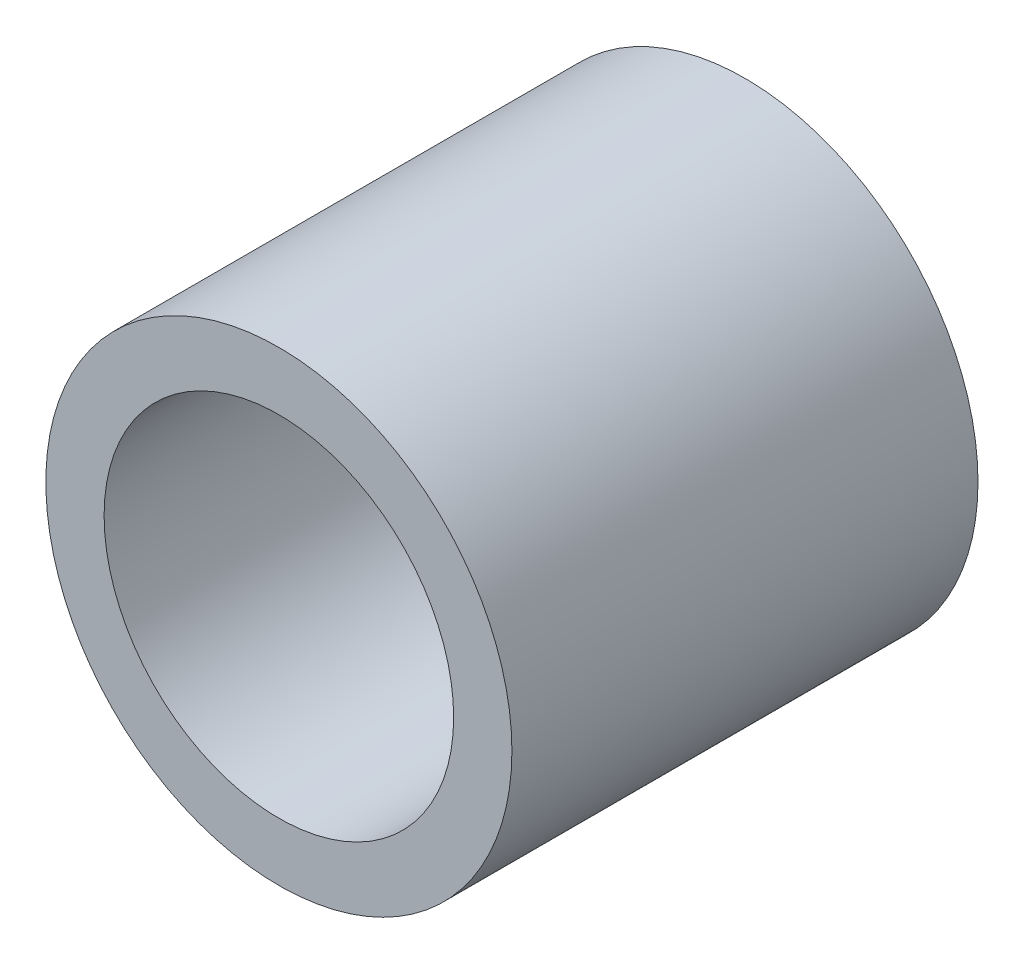
ISO-10303-21;
HEADER;
FILE_DESCRIPTION(('STEP AP214'),'2;1');
FILE_NAME('part.step','',(''),(''),'','','');
FILE_SCHEMA(('AUTOMOTIVE_DESIGN { 1 0 10303 214 1 1 1 1 }'));
ENDSEC;
DATA;
#1=APPLICATION_CONTEXT('core data for automotive mechanical design processes');
#2=APPLICATION_PROTOCOL_DEFINITION('international standard','automotive_design',2000,#1);
#3=PRODUCT_CONTEXT('',#1,'mechanical');
#4=PRODUCT('Part','Part','',(#3));
#5=PRODUCT_RELATED_PRODUCT_CATEGORY('part','',(#4));
#6=PRODUCT_DEFINITION_FORMATION('','',#4);
#7=PRODUCT_DEFINITION_CONTEXT('part definition',#1,'design');
#8=PRODUCT_DEFINITION('design','',#6,#7);
#9=PRODUCT_DEFINITION_SHAPE('','',#8);
#10=(LENGTH_UNIT() NAMED_UNIT(*) SI_UNIT(.MILLI.,.METRE.));
#11=(NAMED_UNIT(*) PLANE_ANGLE_UNIT() SI_UNIT($,.RADIAN.));
#12=(NAMED_UNIT(*) SI_UNIT($,.STERADIAN.) SOLID_ANGLE_UNIT());
#13=UNCERTAINTY_MEASURE_WITH_UNIT(LENGTH_MEASURE(1.E-05),#10,'distance_accuracy_value','');
#14=(GEOMETRIC_REPRESENTATION_CONTEXT(3) GLOBAL_UNCERTAINTY_ASSIGNED_CONTEXT((#13)) GLOBAL_UNIT_ASSIGNED_CONTEXT((#10,
#11,#12)) REPRESENTATION_CONTEXT('',''));
#15=CARTESIAN_POINT('',(0.,0.,0.));
#16=DIRECTION('',(0.,0.,1.));
#17=DIRECTION('',(1.,0.,0.));
#18=AXIS2_PLACEMENT_3D('',#15,#16,#17);
#19=CARTESIAN_POINT('',(0.,0.,12.7));
#20=DIRECTION('',(0.,0.,1.));
#21=DIRECTION('',(1.,0.,0.));
#22=AXIS2_PLACEMENT_3D('',#19,#20,#21);
#23=PLANE('',#22);
#24=CARTESIAN_POINT('',(0.,0.,12.7));
#25=DIRECTION('',(0.,0.,1.));
#26=DIRECTION('',(1.,0.,0.));
#27=AXIS2_PLACEMENT_3D('',#24,#25,#26);
#28=CIRCLE('',#27,12.7);
#29=CARTESIAN_POINT('',(12.7,0.,12.7));
#30=VERTEX_POINT('',#29);
#31=EDGE_CURVE('E10',#30,#30,#28,.T.);
#32=ORIENTED_EDGE('',*,*,#31,.T.);
#33=EDGE_LOOP('',(#32));
#34=FACE_BOUND('',#33,.T.);
#35=CARTESIAN_POINT('',(0.,0.,12.7));
#36=DIRECTION('',(0.,0.,1.));
#37=DIRECTION('',(1.,0.,0.));
#38=AXIS2_PLACEMENT_3D('',#35,#36,#37);
#39=CIRCLE('',#38,9.525);
#40=CARTESIAN_POINT('',(9.525,0.,12.7));
#41=VERTEX_POINT('',#40);
#42=EDGE_CURVE('E50',#41,#41,#39,.T.);
#43=ORIENTED_EDGE('',*,*,#42,.F.);
#44=EDGE_LOOP('',(#43));
#45=FACE_BOUND('',#44,.T.);
#46=ADVANCED_FACE('F39',(#34,#45),#23,.T.);
#47=CARTESIAN_POINT('',(0.,0.,-12.7));
#48=DIRECTION('',(0.,0.,1.));
#49=DIRECTION('',(1.,0.,0.));
#50=AXIS2_PLACEMENT_3D('',#47,#48,#49);
#51=PLANE('',#50);
#52=CARTESIAN_POINT('',(0.,0.,-12.7));
#53=DIRECTION('',(0.,0.,1.));
#54=DIRECTION('',(1.,0.,0.));
#55=AXIS2_PLACEMENT_3D('',#52,#53,#54);
#56=CIRCLE('',#55,12.7);
#57=CARTESIAN_POINT('',(12.7,0.,-12.7));
#58=VERTEX_POINT('',#57);
#59=EDGE_CURVE('E43',#58,#58,#56,.T.);
#60=ORIENTED_EDGE('',*,*,#59,.F.);
#61=EDGE_LOOP('',(#60));
#62=FACE_BOUND('',#61,.T.);
#63=CARTESIAN_POINT('',(0.,0.,-12.7));
#64=DIRECTION('',(0.,0.,1.));
#65=DIRECTION('',(1.,0.,0.));
#66=AXIS2_PLACEMENT_3D('',#63,#64,#65);
#67=CIRCLE('',#66,9.525);
#68=CARTESIAN_POINT('',(9.525,0.,-12.7));
#69=VERTEX_POINT('',#68);
#70=EDGE_CURVE('E52',#69,#69,#67,.T.);
#71=ORIENTED_EDGE('',*,*,#70,.T.);
#72=EDGE_LOOP('',(#71));
#73=FACE_BOUND('',#72,.T.);
#74=ADVANCED_FACE('F62',(#62,#73),#51,.F.);
#75=CARTESIAN_POINT('',(0.,0.,12.7));
#76=DIRECTION('',(0.,0.,-1.));
#77=DIRECTION('',(-1.,0.,0.));
#78=AXIS2_PLACEMENT_3D('',#75,#76,#77);
#79=CYLINDRICAL_SURFACE('',#78,12.7);
#80=ORIENTED_EDGE('',*,*,#31,.F.);
#81=EDGE_LOOP('',(#80));
#82=FACE_BOUND('',#81,.T.);
#83=ORIENTED_EDGE('',*,*,#59,.T.);
#84=EDGE_LOOP('',(#83));
#85=FACE_BOUND('',#84,.T.);
#86=ADVANCED_FACE('F41',(#82,#85),#79,.T.);
#87=CARTESIAN_POINT('',(0.,0.,12.7));
#88=DIRECTION('',(0.,0.,-1.));
#89=DIRECTION('',(-1.,0.,0.));
#90=AXIS2_PLACEMENT_3D('',#87,#88,#89);
#91=CYLINDRICAL_SURFACE('',#90,9.525);
#92=ORIENTED_EDGE('',*,*,#42,.T.);
#93=EDGE_LOOP('',(#92));
#94=FACE_BOUND('',#93,.T.);
#95=ORIENTED_EDGE('',*,*,#70,.F.);
#96=EDGE_LOOP('',(#95));
#97=FACE_BOUND('',#96,.T.);
#98=ADVANCED_FACE('F58',(#94,#97),#91,.F.);
#99=CLOSED_SHELL('',(#46,#74,#86,#98));
#100=MANIFOLD_SOLID_BREP('B2',#99);
#101=ADVANCED_BREP_SHAPE_REPRESENTATION('',(#18,#100),#14);
#102=SHAPE_DEFINITION_REPRESENTATION(#9,#101);
ENDSEC;
END-ISO-10303-21;
